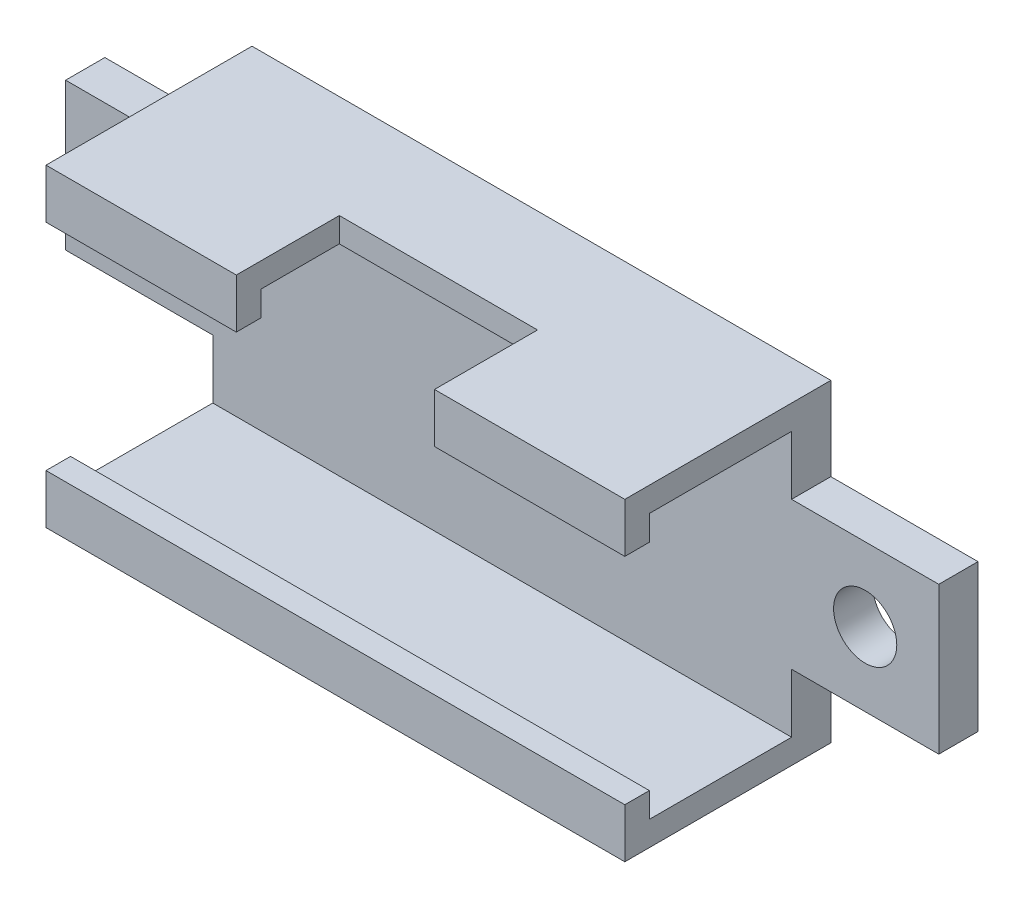
ISO-10303-21;
HEADER;
FILE_DESCRIPTION(('STEP AP214'),'2;1');
FILE_NAME('part.step','',(''),(''),'','','');
FILE_SCHEMA(('AUTOMOTIVE_DESIGN { 1 0 10303 214 1 1 1 1 }'));
ENDSEC;
DATA;
#1=APPLICATION_CONTEXT('core data for automotive mechanical design processes');
#2=APPLICATION_PROTOCOL_DEFINITION('international standard','automotive_design',2000,#1);
#3=PRODUCT_CONTEXT('',#1,'mechanical');
#4=PRODUCT('Part','Part','',(#3));
#5=PRODUCT_RELATED_PRODUCT_CATEGORY('part','',(#4));
#6=PRODUCT_DEFINITION_FORMATION('','',#4);
#7=PRODUCT_DEFINITION_CONTEXT('part definition',#1,'design');
#8=PRODUCT_DEFINITION('design','',#6,#7);
#9=PRODUCT_DEFINITION_SHAPE('','',#8);
#10=(LENGTH_UNIT() NAMED_UNIT(*) SI_UNIT(.MILLI.,.METRE.));
#11=(NAMED_UNIT(*) PLANE_ANGLE_UNIT() SI_UNIT($,.RADIAN.));
#12=(NAMED_UNIT(*) SI_UNIT($,.STERADIAN.) SOLID_ANGLE_UNIT());
#13=UNCERTAINTY_MEASURE_WITH_UNIT(LENGTH_MEASURE(1.E-05),#10,'distance_accuracy_value','');
#14=(GEOMETRIC_REPRESENTATION_CONTEXT(3) GLOBAL_UNCERTAINTY_ASSIGNED_CONTEXT((#13)) GLOBAL_UNIT_ASSIGNED_CONTEXT((#10,
#11,#12)) REPRESENTATION_CONTEXT('',''));
#15=CARTESIAN_POINT('',(0.,0.,0.));
#16=DIRECTION('',(0.,0.,1.));
#17=DIRECTION('',(1.,0.,0.));
#18=AXIS2_PLACEMENT_3D('',#15,#16,#17);
#19=CARTESIAN_POINT('',(0.,0.,8.5));
#20=DIRECTION('',(0.,0.,1.));
#21=DIRECTION('',(1.,0.,0.));
#22=AXIS2_PLACEMENT_3D('',#19,#20,#21);
#23=PLANE('',#22);
#24=DIRECTION('',(0.,-1.,0.));
#25=VECTOR('',#24,1.);
#26=CARTESIAN_POINT('',(9.7,16.75,8.5));
#27=LINE('',#26,#25);
#28=CARTESIAN_POINT('',(9.7,16.,8.5));
#29=VERTEX_POINT('',#28);
#30=CARTESIAN_POINT('',(9.7,13.48,8.5));
#31=VERTEX_POINT('',#30);
#32=EDGE_CURVE('E428',#29,#31,#27,.T.);
#33=ORIENTED_EDGE('',*,*,#32,.F.);
#34=DIRECTION('',(-1.,0.,0.));
#35=VECTOR('',#34,1.);
#36=CARTESIAN_POINT('',(0.,16.,8.5));
#37=LINE('',#36,#35);
#38=CARTESIAN_POINT('',(0.,16.,8.5));
#39=VERTEX_POINT('',#38);
#40=EDGE_CURVE('E243',#29,#39,#37,.T.);
#41=ORIENTED_EDGE('',*,*,#40,.T.);
#42=DIRECTION('',(0.,-1.,0.));
#43=VECTOR('',#42,1.);
#44=CARTESIAN_POINT('',(0.,16.,8.5));
#45=LINE('',#44,#43);
#46=CARTESIAN_POINT('',(0.,13.48,8.5));
#47=VERTEX_POINT('',#46);
#48=EDGE_CURVE('E315',#39,#47,#45,.T.);
#49=ORIENTED_EDGE('',*,*,#48,.T.);
#50=DIRECTION('',(-1.,0.,0.));
#51=VECTOR('',#50,1.);
#52=CARTESIAN_POINT('',(0.,13.48,8.5));
#53=LINE('',#52,#51);
#54=EDGE_CURVE('E283',#31,#47,#53,.T.);
#55=ORIENTED_EDGE('',*,*,#54,.F.);
#56=EDGE_LOOP('',(#33,#41,#49,#55));
#57=FACE_BOUND('',#56,.T.);
#58=ADVANCED_FACE('F43',(#57),#23,.T.);
#59=CARTESIAN_POINT('',(0.,13.48,7.25));
#60=DIRECTION('',(0.,0.,1.));
#61=DIRECTION('',(1.,0.,0.));
#62=AXIS2_PLACEMENT_3D('',#59,#60,#61);
#63=PLANE('',#62);
#64=DIRECTION('',(1.,0.,0.));
#65=VECTOR('',#64,1.);
#66=CARTESIAN_POINT('',(0.,14.75,7.25));
#67=LINE('',#66,#65);
#68=CARTESIAN_POINT('',(0.,14.75,7.25));
#69=VERTEX_POINT('',#68);
#70=CARTESIAN_POINT('',(9.7,14.75,7.25));
#71=VERTEX_POINT('',#70);
#72=EDGE_CURVE('E276',#69,#71,#67,.T.);
#73=ORIENTED_EDGE('',*,*,#72,.T.);
#74=DIRECTION('',(0.,-1.,0.));
#75=VECTOR('',#74,1.);
#76=CARTESIAN_POINT('',(9.7,13.48,7.25));
#77=LINE('',#76,#75);
#78=CARTESIAN_POINT('',(9.7,13.48,7.25));
#79=VERTEX_POINT('',#78);
#80=EDGE_CURVE('E227',#71,#79,#77,.T.);
#81=ORIENTED_EDGE('',*,*,#80,.T.);
#82=DIRECTION('',(1.,0.,0.));
#83=VECTOR('',#82,1.);
#84=CARTESIAN_POINT('',(0.,13.48,7.25));
#85=LINE('',#84,#83);
#86=CARTESIAN_POINT('',(0.,13.48,7.25));
#87=VERTEX_POINT('',#86);
#88=EDGE_CURVE('E277',#87,#79,#85,.T.);
#89=ORIENTED_EDGE('',*,*,#88,.F.);
#90=DIRECTION('',(0.,1.,0.));
#91=VECTOR('',#90,1.);
#92=CARTESIAN_POINT('',(0.,13.48,7.25));
#93=LINE('',#92,#91);
#94=EDGE_CURVE('E292',#87,#69,#93,.T.);
#95=ORIENTED_EDGE('',*,*,#94,.T.);
#96=EDGE_LOOP('',(#73,#81,#89,#95));
#97=FACE_BOUND('',#96,.T.);
#98=ADVANCED_FACE('F432',(#97),#63,.F.);
#99=CARTESIAN_POINT('',(0.,13.48,0.));
#100=DIRECTION('',(0.,-1.,0.));
#101=DIRECTION('',(0.,0.,-1.));
#102=AXIS2_PLACEMENT_3D('',#99,#100,#101);
#103=PLANE('',#102);
#104=DIRECTION('',(0.,0.,-1.));
#105=VECTOR('',#104,1.);
#106=CARTESIAN_POINT('',(9.7,13.48,0.));
#107=LINE('',#106,#105);
#108=EDGE_CURVE('E51',#31,#79,#107,.T.);
#109=ORIENTED_EDGE('',*,*,#108,.F.);
#110=ORIENTED_EDGE('',*,*,#54,.T.);
#111=DIRECTION('',(0.,0.,-1.));
#112=VECTOR('',#111,1.);
#113=CARTESIAN_POINT('',(0.,13.48,8.5));
#114=LINE('',#113,#112);
#115=EDGE_CURVE('E272',#47,#87,#114,.T.);
#116=ORIENTED_EDGE('',*,*,#115,.T.);
#117=ORIENTED_EDGE('',*,*,#88,.T.);
#118=EDGE_LOOP('',(#109,#110,#116,#117));
#119=FACE_BOUND('',#118,.T.);
#120=ADVANCED_FACE('F434',(#119),#103,.T.);
#121=CARTESIAN_POINT('',(0.,14.75,8.5));
#122=DIRECTION('',(0.,1.,0.));
#123=DIRECTION('',(0.,0.,1.));
#124=AXIS2_PLACEMENT_3D('',#121,#122,#123);
#125=PLANE('',#124);
#126=DIRECTION('',(-1.,0.,0.));
#127=VECTOR('',#126,1.);
#128=CARTESIAN_POINT('',(0.,14.75,3.25));
#129=LINE('',#128,#127);
#130=CARTESIAN_POINT('',(19.8,14.75,3.25));
#131=VERTEX_POINT('',#130);
#132=CARTESIAN_POINT('',(9.7,14.75,3.25));
#133=VERTEX_POINT('',#132);
#134=EDGE_CURVE('E235',#131,#133,#129,.T.);
#135=ORIENTED_EDGE('',*,*,#134,.T.);
#136=DIRECTION('',(0.,0.,1.));
#137=VECTOR('',#136,1.);
#138=CARTESIAN_POINT('',(9.7,14.75,8.5));
#139=LINE('',#138,#137);
#140=EDGE_CURVE('E246',#133,#71,#139,.T.);
#141=ORIENTED_EDGE('',*,*,#140,.T.);
#142=ORIENTED_EDGE('',*,*,#72,.F.);
#143=DIRECTION('',(0.,0.,-1.));
#144=VECTOR('',#143,1.);
#145=CARTESIAN_POINT('',(0.,14.75,8.5));
#146=LINE('',#145,#144);
#147=CARTESIAN_POINT('',(0.,14.75,0.));
#148=VERTEX_POINT('',#147);
#149=EDGE_CURVE('E294',#69,#148,#146,.T.);
#150=ORIENTED_EDGE('',*,*,#149,.T.);
#151=DIRECTION('',(1.,0.,0.));
#152=VECTOR('',#151,1.);
#153=CARTESIAN_POINT('',(0.,14.75,0.));
#154=LINE('',#153,#152);
#155=CARTESIAN_POINT('',(29.5,14.75,0.));
#156=VERTEX_POINT('',#155);
#157=EDGE_CURVE('E306',#148,#156,#154,.T.);
#158=ORIENTED_EDGE('',*,*,#157,.T.);
#159=DIRECTION('',(0.,0.,-1.));
#160=VECTOR('',#159,1.);
#161=CARTESIAN_POINT('',(29.5,14.75,8.5));
#162=LINE('',#161,#160);
#163=CARTESIAN_POINT('',(29.5,14.75,7.25));
#164=VERTEX_POINT('',#163);
#165=EDGE_CURVE('E311',#164,#156,#162,.T.);
#166=ORIENTED_EDGE('',*,*,#165,.F.);
#167=CARTESIAN_POINT('',(19.8,14.75,7.25));
#168=VERTEX_POINT('',#167);
#169=EDGE_CURVE('E271',#168,#164,#67,.T.);
#170=ORIENTED_EDGE('',*,*,#169,.F.);
#171=DIRECTION('',(0.,0.,-1.));
#172=VECTOR('',#171,1.);
#173=CARTESIAN_POINT('',(19.8,14.75,8.5));
#174=LINE('',#173,#172);
#175=EDGE_CURVE('E228',#168,#131,#174,.T.);
#176=ORIENTED_EDGE('',*,*,#175,.T.);
#177=EDGE_LOOP('',(#135,#141,#142,#150,#158,#166,#170,#176));
#178=FACE_BOUND('',#177,.T.);
#179=ADVANCED_FACE('F442',(#178),#125,.F.);
#180=CARTESIAN_POINT('',(0.,0.,0.));
#181=DIRECTION('',(0.,0.,-1.));
#182=DIRECTION('',(-1.,0.,0.));
#183=AXIS2_PLACEMENT_3D('',#180,#181,#182);
#184=PLANE('',#183);
#185=CARTESIAN_POINT('',(33.25,8.,0.));
#186=DIRECTION('',(0.,0.,1.));
#187=DIRECTION('',(1.,0.,0.));
#188=AXIS2_PLACEMENT_3D('',#185,#186,#187);
#189=CIRCLE('',#188,1.61);
#190=CARTESIAN_POINT('',(34.86,8.,0.));
#191=VERTEX_POINT('',#190);
#192=EDGE_CURVE('E323',#191,#191,#189,.T.);
#193=ORIENTED_EDGE('',*,*,#192,.F.);
#194=EDGE_LOOP('',(#193));
#195=FACE_BOUND('',#194,.T.);
#196=CARTESIAN_POINT('',(-3.75,8.,0.));
#197=DIRECTION('',(0.,0.,1.));
#198=DIRECTION('',(1.,0.,0.));
#199=AXIS2_PLACEMENT_3D('',#196,#197,#198);
#200=CIRCLE('',#199,1.61);
#201=CARTESIAN_POINT('',(-2.14,8.,0.));
#202=VERTEX_POINT('',#201);
#203=EDGE_CURVE('E309',#202,#202,#200,.T.);
#204=ORIENTED_EDGE('',*,*,#203,.F.);
#205=EDGE_LOOP('',(#204));
#206=FACE_BOUND('',#205,.T.);
#207=DIRECTION('',(-1.,0.,0.));
#208=VECTOR('',#207,1.);
#209=CARTESIAN_POINT('',(0.,1.25,0.));
#210=LINE('',#209,#208);
#211=CARTESIAN_POINT('',(29.5,1.25,0.));
#212=VERTEX_POINT('',#211);
#213=CARTESIAN_POINT('',(0.,1.25,0.));
#214=VERTEX_POINT('',#213);
#215=EDGE_CURVE('E299',#212,#214,#210,.T.);
#216=ORIENTED_EDGE('',*,*,#215,.F.);
#217=DIRECTION('',(0.,1.,0.));
#218=VECTOR('',#217,1.);
#219=CARTESIAN_POINT('',(29.5,4.25,0.));
#220=LINE('',#219,#218);
#221=CARTESIAN_POINT('',(29.5,4.25,0.));
#222=VERTEX_POINT('',#221);
#223=EDGE_CURVE('E386',#212,#222,#220,.T.);
#224=ORIENTED_EDGE('',*,*,#223,.T.);
#225=DIRECTION('',(1.,0.,0.));
#226=VECTOR('',#225,1.);
#227=CARTESIAN_POINT('',(29.5,4.25,0.));
#228=LINE('',#227,#226);
#229=CARTESIAN_POINT('',(37.,4.25,0.));
#230=VERTEX_POINT('',#229);
#231=EDGE_CURVE('E388',#222,#230,#228,.T.);
#232=ORIENTED_EDGE('',*,*,#231,.T.);
#233=DIRECTION('',(0.,1.,0.));
#234=VECTOR('',#233,1.);
#235=CARTESIAN_POINT('',(37.,11.75,0.));
#236=LINE('',#235,#234);
#237=CARTESIAN_POINT('',(37.,11.75,0.));
#238=VERTEX_POINT('',#237);
#239=EDGE_CURVE('E391',#230,#238,#236,.T.);
#240=ORIENTED_EDGE('',*,*,#239,.T.);
#241=DIRECTION('',(-1.,0.,0.));
#242=VECTOR('',#241,1.);
#243=CARTESIAN_POINT('',(29.5,11.75,0.));
#244=LINE('',#243,#242);
#245=CARTESIAN_POINT('',(29.5,11.75,0.));
#246=VERTEX_POINT('',#245);
#247=EDGE_CURVE('E394',#238,#246,#244,.T.);
#248=ORIENTED_EDGE('',*,*,#247,.T.);
#249=DIRECTION('',(0.,1.,0.));
#250=VECTOR('',#249,1.);
#251=CARTESIAN_POINT('',(29.5,16.,0.));
#252=LINE('',#251,#250);
#253=EDGE_CURVE('E339',#246,#156,#252,.T.);
#254=ORIENTED_EDGE('',*,*,#253,.T.);
#255=ORIENTED_EDGE('',*,*,#157,.F.);
#256=DIRECTION('',(0.,-1.,0.));
#257=VECTOR('',#256,1.);
#258=CARTESIAN_POINT('',(0.,16.,0.));
#259=LINE('',#258,#257);
#260=CARTESIAN_POINT('',(0.,11.75,0.));
#261=VERTEX_POINT('',#260);
#262=EDGE_CURVE('E334',#148,#261,#259,.T.);
#263=ORIENTED_EDGE('',*,*,#262,.T.);
#264=DIRECTION('',(-1.,0.,0.));
#265=VECTOR('',#264,1.);
#266=CARTESIAN_POINT('',(0.,11.75,0.));
#267=LINE('',#266,#265);
#268=CARTESIAN_POINT('',(-7.5,11.75,0.));
#269=VERTEX_POINT('',#268);
#270=EDGE_CURVE('E374',#261,#269,#267,.T.);
#271=ORIENTED_EDGE('',*,*,#270,.T.);
#272=DIRECTION('',(0.,-1.,0.));
#273=VECTOR('',#272,1.);
#274=CARTESIAN_POINT('',(-7.5,11.75,0.));
#275=LINE('',#274,#273);
#276=CARTESIAN_POINT('',(-7.5,4.25,0.));
#277=VERTEX_POINT('',#276);
#278=EDGE_CURVE('E377',#269,#277,#275,.T.);
#279=ORIENTED_EDGE('',*,*,#278,.T.);
#280=DIRECTION('',(1.,0.,0.));
#281=VECTOR('',#280,1.);
#282=CARTESIAN_POINT('',(0.,4.25,0.));
#283=LINE('',#282,#281);
#284=CARTESIAN_POINT('',(0.,4.25,0.));
#285=VERTEX_POINT('',#284);
#286=EDGE_CURVE('E380',#277,#285,#283,.T.);
#287=ORIENTED_EDGE('',*,*,#286,.T.);
#288=DIRECTION('',(0.,-1.,0.));
#289=VECTOR('',#288,1.);
#290=CARTESIAN_POINT('',(0.,4.25,0.));
#291=LINE('',#290,#289);
#292=EDGE_CURVE('E383',#285,#214,#291,.T.);
#293=ORIENTED_EDGE('',*,*,#292,.T.);
#294=EDGE_LOOP('',(#216,#224,#232,#240,#248,#254,#255,#263,#271,#279,#287,#293));
#295=FACE_BOUND('',#294,.T.);
#296=ADVANCED_FACE('F508',(#195,#206,#295),#184,.F.);
#297=CARTESIAN_POINT('',(0.,16.,-2.));
#298=DIRECTION('',(-1.,0.,0.));
#299=DIRECTION('',(0.,-1.,0.));
#300=AXIS2_PLACEMENT_3D('',#297,#298,#299);
#301=PLANE('',#300);
#302=ORIENTED_EDGE('',*,*,#262,.F.);
#303=ORIENTED_EDGE('',*,*,#149,.F.);
#304=ORIENTED_EDGE('',*,*,#94,.F.);
#305=ORIENTED_EDGE('',*,*,#115,.F.);
#306=ORIENTED_EDGE('',*,*,#48,.F.);
#307=DIRECTION('',(0.,0.,1.));
#308=VECTOR('',#307,1.);
#309=CARTESIAN_POINT('',(0.,16.,-2.));
#310=LINE('',#309,#308);
#311=CARTESIAN_POINT('',(0.,16.,-2.));
#312=VERTEX_POINT('',#311);
#313=EDGE_CURVE('E399',#312,#39,#310,.T.);
#314=ORIENTED_EDGE('',*,*,#313,.F.);
#315=DIRECTION('',(0.,-1.,0.));
#316=VECTOR('',#315,1.);
#317=CARTESIAN_POINT('',(0.,16.,-2.));
#318=LINE('',#317,#316);
#319=CARTESIAN_POINT('',(0.,11.75,-2.));
#320=VERTEX_POINT('',#319);
#321=EDGE_CURVE('E335',#312,#320,#318,.T.);
#322=ORIENTED_EDGE('',*,*,#321,.T.);
#323=DIRECTION('',(0.,0.,1.));
#324=VECTOR('',#323,1.);
#325=CARTESIAN_POINT('',(0.,11.75,-2.));
#326=LINE('',#325,#324);
#327=EDGE_CURVE('E372',#320,#261,#326,.T.);
#328=ORIENTED_EDGE('',*,*,#327,.T.);
#329=EDGE_LOOP('',(#302,#303,#304,#305,#306,#314,#322,#328));
#330=FACE_BOUND('',#329,.T.);
#331=ADVANCED_FACE('F45',(#330),#301,.T.);
#332=CARTESIAN_POINT('',(0.,16.,-2.));
#333=DIRECTION('',(0.,1.,0.));
#334=DIRECTION('',(0.,0.,1.));
#335=AXIS2_PLACEMENT_3D('',#332,#333,#334);
#336=PLANE('',#335);
#337=DIRECTION('',(0.,0.,1.));
#338=VECTOR('',#337,1.);
#339=CARTESIAN_POINT('',(9.7,16.,-2.));
#340=LINE('',#339,#338);
#341=CARTESIAN_POINT('',(9.7,16.,3.25));
#342=VERTEX_POINT('',#341);
#343=EDGE_CURVE('E241',#342,#29,#340,.T.);
#344=ORIENTED_EDGE('',*,*,#343,.F.);
#345=DIRECTION('',(-1.,0.,0.));
#346=VECTOR('',#345,1.);
#347=CARTESIAN_POINT('',(0.,16.,3.25));
#348=LINE('',#347,#346);
#349=CARTESIAN_POINT('',(19.8,16.,3.25));
#350=VERTEX_POINT('',#349);
#351=EDGE_CURVE('E11',#350,#342,#348,.T.);
#352=ORIENTED_EDGE('',*,*,#351,.F.);
#353=DIRECTION('',(0.,0.,-1.));
#354=VECTOR('',#353,1.);
#355=CARTESIAN_POINT('',(19.8,16.,-2.));
#356=LINE('',#355,#354);
#357=CARTESIAN_POINT('',(19.8,16.,8.5));
#358=VERTEX_POINT('',#357);
#359=EDGE_CURVE('E216',#358,#350,#356,.T.);
#360=ORIENTED_EDGE('',*,*,#359,.F.);
#361=CARTESIAN_POINT('',(29.5,16.,8.5));
#362=VERTEX_POINT('',#361);
#363=EDGE_CURVE('E316',#362,#358,#37,.T.);
#364=ORIENTED_EDGE('',*,*,#363,.F.);
#365=DIRECTION('',(0.,0.,1.));
#366=VECTOR('',#365,1.);
#367=CARTESIAN_POINT('',(29.5,16.,-2.));
#368=LINE('',#367,#366);
#369=CARTESIAN_POINT('',(29.5,16.,-2.));
#370=VERTEX_POINT('',#369);
#371=EDGE_CURVE('E402',#370,#362,#368,.T.);
#372=ORIENTED_EDGE('',*,*,#371,.F.);
#373=DIRECTION('',(-1.,0.,0.));
#374=VECTOR('',#373,1.);
#375=CARTESIAN_POINT('',(0.,16.,-2.));
#376=LINE('',#375,#374);
#377=EDGE_CURVE('E369',#370,#312,#376,.T.);
#378=ORIENTED_EDGE('',*,*,#377,.T.);
#379=ORIENTED_EDGE('',*,*,#313,.T.);
#380=ORIENTED_EDGE('',*,*,#40,.F.);
#381=EDGE_LOOP('',(#344,#352,#360,#364,#372,#378,#379,#380));
#382=FACE_BOUND('',#381,.T.);
#383=ADVANCED_FACE('F239',(#382),#336,.T.);
#384=CARTESIAN_POINT('',(29.5,16.,-2.));
#385=DIRECTION('',(1.,0.,0.));
#386=DIRECTION('',(0.,0.,-1.));
#387=AXIS2_PLACEMENT_3D('',#384,#385,#386);
#388=PLANE('',#387);
#389=ORIENTED_EDGE('',*,*,#253,.F.);
#390=DIRECTION('',(0.,0.,1.));
#391=VECTOR('',#390,1.);
#392=CARTESIAN_POINT('',(29.5,11.75,-2.));
#393=LINE('',#392,#391);
#394=CARTESIAN_POINT('',(29.5,11.75,-2.));
#395=VERTEX_POINT('',#394);
#396=EDGE_CURVE('E404',#395,#246,#393,.T.);
#397=ORIENTED_EDGE('',*,*,#396,.F.);
#398=DIRECTION('',(0.,1.,0.));
#399=VECTOR('',#398,1.);
#400=CARTESIAN_POINT('',(29.5,16.,-2.));
#401=LINE('',#400,#399);
#402=EDGE_CURVE('E366',#395,#370,#401,.T.);
#403=ORIENTED_EDGE('',*,*,#402,.T.);
#404=ORIENTED_EDGE('',*,*,#371,.T.);
#405=DIRECTION('',(0.,1.,0.));
#406=VECTOR('',#405,1.);
#407=CARTESIAN_POINT('',(29.5,16.,8.5));
#408=LINE('',#407,#406);
#409=CARTESIAN_POINT('',(29.5,13.48,8.5));
#410=VERTEX_POINT('',#409);
#411=EDGE_CURVE('E318',#410,#362,#408,.T.);
#412=ORIENTED_EDGE('',*,*,#411,.F.);
#413=DIRECTION('',(0.,0.,1.));
#414=VECTOR('',#413,1.);
#415=CARTESIAN_POINT('',(29.5,13.48,8.5));
#416=LINE('',#415,#414);
#417=CARTESIAN_POINT('',(29.5,13.48,7.25));
#418=VERTEX_POINT('',#417);
#419=EDGE_CURVE('E280',#418,#410,#416,.T.);
#420=ORIENTED_EDGE('',*,*,#419,.F.);
#421=DIRECTION('',(0.,1.,0.));
#422=VECTOR('',#421,1.);
#423=CARTESIAN_POINT('',(29.5,13.48,7.25));
#424=LINE('',#423,#422);
#425=EDGE_CURVE('E287',#418,#164,#424,.T.);
#426=ORIENTED_EDGE('',*,*,#425,.T.);
#427=ORIENTED_EDGE('',*,*,#165,.T.);
#428=EDGE_LOOP('',(#389,#397,#403,#404,#412,#420,#426,#427));
#429=FACE_BOUND('',#428,.T.);
#430=ADVANCED_FACE('F465',(#429),#388,.T.);
#431=CARTESIAN_POINT('',(29.5,11.75,-2.));
#432=DIRECTION('',(0.,1.,0.));
#433=DIRECTION('',(0.,0.,1.));
#434=AXIS2_PLACEMENT_3D('',#431,#432,#433);
#435=PLANE('',#434);
#436=ORIENTED_EDGE('',*,*,#247,.F.);
#437=DIRECTION('',(0.,0.,1.));
#438=VECTOR('',#437,1.);
#439=CARTESIAN_POINT('',(37.,11.75,-2.));
#440=LINE('',#439,#438);
#441=CARTESIAN_POINT('',(37.,11.75,-2.));
#442=VERTEX_POINT('',#441);
#443=EDGE_CURVE('E406',#442,#238,#440,.T.);
#444=ORIENTED_EDGE('',*,*,#443,.F.);
#445=DIRECTION('',(-1.,0.,0.));
#446=VECTOR('',#445,1.);
#447=CARTESIAN_POINT('',(29.5,11.75,-2.));
#448=LINE('',#447,#446);
#449=EDGE_CURVE('E363',#442,#395,#448,.T.);
#450=ORIENTED_EDGE('',*,*,#449,.T.);
#451=ORIENTED_EDGE('',*,*,#396,.T.);
#452=EDGE_LOOP('',(#436,#444,#450,#451));
#453=FACE_BOUND('',#452,.T.);
#454=ADVANCED_FACE('F514',(#453),#435,.T.);
#455=CARTESIAN_POINT('',(37.,11.75,-2.));
#456=DIRECTION('',(1.,0.,0.));
#457=DIRECTION('',(0.,0.,-1.));
#458=AXIS2_PLACEMENT_3D('',#455,#456,#457);
#459=PLANE('',#458);
#460=ORIENTED_EDGE('',*,*,#239,.F.);
#461=DIRECTION('',(0.,0.,1.));
#462=VECTOR('',#461,1.);
#463=CARTESIAN_POINT('',(37.,4.25,-2.));
#464=LINE('',#463,#462);
#465=CARTESIAN_POINT('',(37.,4.25,-2.));
#466=VERTEX_POINT('',#465);
#467=EDGE_CURVE('E408',#466,#230,#464,.T.);
#468=ORIENTED_EDGE('',*,*,#467,.F.);
#469=DIRECTION('',(0.,1.,0.));
#470=VECTOR('',#469,1.);
#471=CARTESIAN_POINT('',(37.,11.75,-2.));
#472=LINE('',#471,#470);
#473=EDGE_CURVE('E360',#466,#442,#472,.T.);
#474=ORIENTED_EDGE('',*,*,#473,.T.);
#475=ORIENTED_EDGE('',*,*,#443,.T.);
#476=EDGE_LOOP('',(#460,#468,#474,#475));
#477=FACE_BOUND('',#476,.T.);
#478=ADVANCED_FACE('F517',(#477),#459,.T.);
#479=CARTESIAN_POINT('',(29.5,4.25,-2.));
#480=DIRECTION('',(0.,-1.,0.));
#481=DIRECTION('',(0.,0.,-1.));
#482=AXIS2_PLACEMENT_3D('',#479,#480,#481);
#483=PLANE('',#482);
#484=ORIENTED_EDGE('',*,*,#231,.F.);
#485=DIRECTION('',(0.,0.,1.));
#486=VECTOR('',#485,1.);
#487=CARTESIAN_POINT('',(29.5,4.25,-2.));
#488=LINE('',#487,#486);
#489=CARTESIAN_POINT('',(29.5,4.25,-2.));
#490=VERTEX_POINT('',#489);
#491=EDGE_CURVE('E410',#490,#222,#488,.T.);
#492=ORIENTED_EDGE('',*,*,#491,.F.);
#493=DIRECTION('',(1.,0.,0.));
#494=VECTOR('',#493,1.);
#495=CARTESIAN_POINT('',(29.5,4.25,-2.));
#496=LINE('',#495,#494);
#497=EDGE_CURVE('E357',#490,#466,#496,.T.);
#498=ORIENTED_EDGE('',*,*,#497,.T.);
#499=ORIENTED_EDGE('',*,*,#467,.T.);
#500=EDGE_LOOP('',(#484,#492,#498,#499));
#501=FACE_BOUND('',#500,.T.);
#502=ADVANCED_FACE('F521',(#501),#483,.T.);
#503=CARTESIAN_POINT('',(29.5,4.25,-2.));
#504=DIRECTION('',(1.,0.,0.));
#505=DIRECTION('',(0.,0.,-1.));
#506=AXIS2_PLACEMENT_3D('',#503,#504,#505);
#507=PLANE('',#506);
#508=ORIENTED_EDGE('',*,*,#223,.F.);
#509=DIRECTION('',(0.,0.,-1.));
#510=VECTOR('',#509,1.);
#511=CARTESIAN_POINT('',(29.5,1.25,8.5));
#512=LINE('',#511,#510);
#513=CARTESIAN_POINT('',(29.5,1.25000000000001,7.25));
#514=VERTEX_POINT('',#513);
#515=EDGE_CURVE('E66',#514,#212,#512,.T.);
#516=ORIENTED_EDGE('',*,*,#515,.F.);
#517=DIRECTION('',(0.,-1.,0.));
#518=VECTOR('',#517,1.);
#519=CARTESIAN_POINT('',(29.5,2.52000000000001,7.25));
#520=LINE('',#519,#518);
#521=CARTESIAN_POINT('',(29.5,2.52000000000001,7.25));
#522=VERTEX_POINT('',#521);
#523=EDGE_CURVE('E269',#522,#514,#520,.T.);
#524=ORIENTED_EDGE('',*,*,#523,.F.);
#525=DIRECTION('',(0.,0.,1.));
#526=VECTOR('',#525,1.);
#527=CARTESIAN_POINT('',(29.5,2.52000000000001,8.5));
#528=LINE('',#527,#526);
#529=CARTESIAN_POINT('',(29.5,2.52000000000001,8.5));
#530=VERTEX_POINT('',#529);
#531=EDGE_CURVE('E260',#522,#530,#528,.T.);
#532=ORIENTED_EDGE('',*,*,#531,.T.);
#533=DIRECTION('',(0.,1.,0.));
#534=VECTOR('',#533,1.);
#535=CARTESIAN_POINT('',(29.5,0.,8.5));
#536=LINE('',#535,#534);
#537=CARTESIAN_POINT('',(29.5,0.,8.5));
#538=VERTEX_POINT('',#537);
#539=EDGE_CURVE('E302',#538,#530,#536,.T.);
#540=ORIENTED_EDGE('',*,*,#539,.F.);
#541=DIRECTION('',(0.,0.,1.));
#542=VECTOR('',#541,1.);
#543=CARTESIAN_POINT('',(29.5,0.,-2.));
#544=LINE('',#543,#542);
#545=CARTESIAN_POINT('',(29.5,0.,-2.));
#546=VERTEX_POINT('',#545);
#547=EDGE_CURVE('E413',#546,#538,#544,.T.);
#548=ORIENTED_EDGE('',*,*,#547,.F.);
#549=DIRECTION('',(0.,1.,0.));
#550=VECTOR('',#549,1.);
#551=CARTESIAN_POINT('',(29.5,4.25,-2.));
#552=LINE('',#551,#550);
#553=EDGE_CURVE('E354',#546,#490,#552,.T.);
#554=ORIENTED_EDGE('',*,*,#553,.T.);
#555=ORIENTED_EDGE('',*,*,#491,.T.);
#556=EDGE_LOOP('',(#508,#516,#524,#532,#540,#548,#554,#555));
#557=FACE_BOUND('',#556,.T.);
#558=ADVANCED_FACE('F525',(#557),#507,.T.);
#559=CARTESIAN_POINT('',(0.,0.,-2.));
#560=DIRECTION('',(0.,-1.,0.));
#561=DIRECTION('',(1.,0.,0.));
#562=AXIS2_PLACEMENT_3D('',#559,#560,#561);
#563=PLANE('',#562);
#564=ORIENTED_EDGE('',*,*,#547,.T.);
#565=DIRECTION('',(1.,0.,0.));
#566=VECTOR('',#565,1.);
#567=CARTESIAN_POINT('',(0.,0.,8.5));
#568=LINE('',#567,#566);
#569=CARTESIAN_POINT('',(0.,0.,8.5));
#570=VERTEX_POINT('',#569);
#571=EDGE_CURVE('E298',#570,#538,#568,.T.);
#572=ORIENTED_EDGE('',*,*,#571,.F.);
#573=DIRECTION('',(0.,0.,1.));
#574=VECTOR('',#573,1.);
#575=CARTESIAN_POINT('',(0.,0.,-2.));
#576=LINE('',#575,#574);
#577=CARTESIAN_POINT('',(0.,0.,-2.));
#578=VERTEX_POINT('',#577);
#579=EDGE_CURVE('E415',#578,#570,#576,.T.);
#580=ORIENTED_EDGE('',*,*,#579,.F.);
#581=DIRECTION('',(1.,0.,0.));
#582=VECTOR('',#581,1.);
#583=CARTESIAN_POINT('',(0.,0.,-2.));
#584=LINE('',#583,#582);
#585=EDGE_CURVE('E351',#578,#546,#584,.T.);
#586=ORIENTED_EDGE('',*,*,#585,.T.);
#587=EDGE_LOOP('',(#564,#572,#580,#586));
#588=FACE_BOUND('',#587,.T.);
#589=ADVANCED_FACE('F529',(#588),#563,.T.);
#590=CARTESIAN_POINT('',(0.,4.25,-2.));
#591=DIRECTION('',(-1.,0.,0.));
#592=DIRECTION('',(0.,-1.,0.));
#593=AXIS2_PLACEMENT_3D('',#590,#591,#592);
#594=PLANE('',#593);
#595=ORIENTED_EDGE('',*,*,#292,.F.);
#596=DIRECTION('',(0.,0.,1.));
#597=VECTOR('',#596,1.);
#598=CARTESIAN_POINT('',(0.,4.25,-2.));
#599=LINE('',#598,#597);
#600=CARTESIAN_POINT('',(0.,4.25,-2.));
#601=VERTEX_POINT('',#600);
#602=EDGE_CURVE('E417',#601,#285,#599,.T.);
#603=ORIENTED_EDGE('',*,*,#602,.F.);
#604=DIRECTION('',(0.,-1.,0.));
#605=VECTOR('',#604,1.);
#606=CARTESIAN_POINT('',(0.,4.25,-2.));
#607=LINE('',#606,#605);
#608=EDGE_CURVE('E348',#601,#578,#607,.T.);
#609=ORIENTED_EDGE('',*,*,#608,.T.);
#610=ORIENTED_EDGE('',*,*,#579,.T.);
#611=DIRECTION('',(0.,-1.,0.));
#612=VECTOR('',#611,1.);
#613=CARTESIAN_POINT('',(0.,0.,8.5));
#614=LINE('',#613,#612);
#615=CARTESIAN_POINT('',(0.,2.52,8.5));
#616=VERTEX_POINT('',#615);
#617=EDGE_CURVE('E295',#616,#570,#614,.T.);
#618=ORIENTED_EDGE('',*,*,#617,.F.);
#619=DIRECTION('',(0.,0.,-1.));
#620=VECTOR('',#619,1.);
#621=CARTESIAN_POINT('',(0.,2.52,8.5));
#622=LINE('',#621,#620);
#623=CARTESIAN_POINT('',(0.,2.52,7.25));
#624=VERTEX_POINT('',#623);
#625=EDGE_CURVE('E254',#616,#624,#622,.T.);
#626=ORIENTED_EDGE('',*,*,#625,.T.);
#627=DIRECTION('',(0.,-1.,0.));
#628=VECTOR('',#627,1.);
#629=CARTESIAN_POINT('',(0.,2.52,7.25));
#630=LINE('',#629,#628);
#631=CARTESIAN_POINT('',(0.,1.25,7.25));
#632=VERTEX_POINT('',#631);
#633=EDGE_CURVE('E266',#624,#632,#630,.T.);
#634=ORIENTED_EDGE('',*,*,#633,.T.);
#635=DIRECTION('',(0.,0.,-1.));
#636=VECTOR('',#635,1.);
#637=CARTESIAN_POINT('',(0.,1.25,8.5));
#638=LINE('',#637,#636);
#639=EDGE_CURVE('E304',#632,#214,#638,.T.);
#640=ORIENTED_EDGE('',*,*,#639,.T.);
#641=EDGE_LOOP('',(#595,#603,#609,#610,#618,#626,#634,#640));
#642=FACE_BOUND('',#641,.T.);
#643=ADVANCED_FACE('F533',(#642),#594,.T.);
#644=CARTESIAN_POINT('',(0.,4.25,-2.));
#645=DIRECTION('',(0.,-1.,0.));
#646=DIRECTION('',(1.,0.,0.));
#647=AXIS2_PLACEMENT_3D('',#644,#645,#646);
#648=PLANE('',#647);
#649=ORIENTED_EDGE('',*,*,#286,.F.);
#650=DIRECTION('',(0.,0.,1.));
#651=VECTOR('',#650,1.);
#652=CARTESIAN_POINT('',(-7.5,4.25,-2.));
#653=LINE('',#652,#651);
#654=CARTESIAN_POINT('',(-7.5,4.25,-2.));
#655=VERTEX_POINT('',#654);
#656=EDGE_CURVE('E419',#655,#277,#653,.T.);
#657=ORIENTED_EDGE('',*,*,#656,.F.);
#658=DIRECTION('',(1.,0.,0.));
#659=VECTOR('',#658,1.);
#660=CARTESIAN_POINT('',(0.,4.25,-2.));
#661=LINE('',#660,#659);
#662=EDGE_CURVE('E345',#655,#601,#661,.T.);
#663=ORIENTED_EDGE('',*,*,#662,.T.);
#664=ORIENTED_EDGE('',*,*,#602,.T.);
#665=EDGE_LOOP('',(#649,#657,#663,#664));
#666=FACE_BOUND('',#665,.T.);
#667=ADVANCED_FACE('F537',(#666),#648,.T.);
#668=CARTESIAN_POINT('',(-7.5,11.75,-2.));
#669=DIRECTION('',(-1.,0.,0.));
#670=DIRECTION('',(0.,-1.,0.));
#671=AXIS2_PLACEMENT_3D('',#668,#669,#670);
#672=PLANE('',#671);
#673=ORIENTED_EDGE('',*,*,#278,.F.);
#674=DIRECTION('',(0.,0.,1.));
#675=VECTOR('',#674,1.);
#676=CARTESIAN_POINT('',(-7.5,11.75,-2.));
#677=LINE('',#676,#675);
#678=CARTESIAN_POINT('',(-7.5,11.75,-2.));
#679=VERTEX_POINT('',#678);
#680=EDGE_CURVE('E421',#679,#269,#677,.T.);
#681=ORIENTED_EDGE('',*,*,#680,.F.);
#682=DIRECTION('',(0.,-1.,0.));
#683=VECTOR('',#682,1.);
#684=CARTESIAN_POINT('',(-7.5,11.75,-2.));
#685=LINE('',#684,#683);
#686=EDGE_CURVE('E342',#679,#655,#685,.T.);
#687=ORIENTED_EDGE('',*,*,#686,.T.);
#688=ORIENTED_EDGE('',*,*,#656,.T.);
#689=EDGE_LOOP('',(#673,#681,#687,#688));
#690=FACE_BOUND('',#689,.T.);
#691=ADVANCED_FACE('F541',(#690),#672,.T.);
#692=CARTESIAN_POINT('',(0.,11.75,-2.));
#693=DIRECTION('',(0.,1.,0.));
#694=DIRECTION('',(-1.,0.,0.));
#695=AXIS2_PLACEMENT_3D('',#692,#693,#694);
#696=PLANE('',#695);
#697=ORIENTED_EDGE('',*,*,#270,.F.);
#698=ORIENTED_EDGE('',*,*,#327,.F.);
#699=DIRECTION('',(-1.,0.,0.));
#700=VECTOR('',#699,1.);
#701=CARTESIAN_POINT('',(0.,11.75,-2.));
#702=LINE('',#701,#700);
#703=EDGE_CURVE('E338',#320,#679,#702,.T.);
#704=ORIENTED_EDGE('',*,*,#703,.T.);
#705=ORIENTED_EDGE('',*,*,#680,.T.);
#706=EDGE_LOOP('',(#697,#698,#704,#705));
#707=FACE_BOUND('',#706,.T.);
#708=ADVANCED_FACE('F506',(#707),#696,.T.);
#709=CARTESIAN_POINT('',(0.,0.,-2.));
#710=DIRECTION('',(0.,0.,-1.));
#711=DIRECTION('',(-1.,0.,0.));
#712=AXIS2_PLACEMENT_3D('',#709,#710,#711);
#713=PLANE('',#712);
#714=CARTESIAN_POINT('',(33.25,8.,-2.));
#715=DIRECTION('',(0.,0.,-1.));
#716=DIRECTION('',(-1.,0.,0.));
#717=AXIS2_PLACEMENT_3D('',#714,#715,#716);
#718=CIRCLE('',#717,1.61);
#719=CARTESIAN_POINT('',(34.86,8.,-2.));
#720=VERTEX_POINT('',#719);
#721=EDGE_CURVE('E331',#720,#720,#718,.T.);
#722=ORIENTED_EDGE('',*,*,#721,.F.);
#723=EDGE_LOOP('',(#722));
#724=FACE_BOUND('',#723,.T.);
#725=CARTESIAN_POINT('',(-3.75,8.,-2.));
#726=DIRECTION('',(0.,0.,-1.));
#727=DIRECTION('',(-1.,0.,0.));
#728=AXIS2_PLACEMENT_3D('',#725,#726,#727);
#729=CIRCLE('',#728,1.61);
#730=CARTESIAN_POINT('',(-2.14,8.,-2.));
#731=VERTEX_POINT('',#730);
#732=EDGE_CURVE('E326',#731,#731,#729,.T.);
#733=ORIENTED_EDGE('',*,*,#732,.F.);
#734=EDGE_LOOP('',(#733));
#735=FACE_BOUND('',#734,.T.);
#736=ORIENTED_EDGE('',*,*,#321,.F.);
#737=ORIENTED_EDGE('',*,*,#377,.F.);
#738=ORIENTED_EDGE('',*,*,#402,.F.);
#739=ORIENTED_EDGE('',*,*,#449,.F.);
#740=ORIENTED_EDGE('',*,*,#473,.F.);
#741=ORIENTED_EDGE('',*,*,#497,.F.);
#742=ORIENTED_EDGE('',*,*,#553,.F.);
#743=ORIENTED_EDGE('',*,*,#585,.F.);
#744=ORIENTED_EDGE('',*,*,#608,.F.);
#745=ORIENTED_EDGE('',*,*,#662,.F.);
#746=ORIENTED_EDGE('',*,*,#686,.F.);
#747=ORIENTED_EDGE('',*,*,#703,.F.);
#748=EDGE_LOOP('',(#736,#737,#738,#739,#740,#741,#742,#743,#744,#745,#746,#747));
#749=FACE_BOUND('',#748,.T.);
#750=ADVANCED_FACE('F469',(#724,#735,#749),#713,.T.);
#751=CARTESIAN_POINT('',(-3.75,8.,-7.62));
#752=DIRECTION('',(0.,0.,1.));
#753=DIRECTION('',(1.,0.,0.));
#754=AXIS2_PLACEMENT_3D('',#751,#752,#753);
#755=CYLINDRICAL_SURFACE('',#754,1.61);
#756=CARTESIAN_POINT('',(-2.14,8.,-2.));
#757=CARTESIAN_POINT('',(-2.14,8.,-1.97916666666667));
#758=CARTESIAN_POINT('',(-2.14,8.,-1.95833333333333));
#759=CARTESIAN_POINT('',(-2.14,8.,-1.91666666666667));
#760=CARTESIAN_POINT('',(-2.14,8.,-1.89583333333333));
#761=CARTESIAN_POINT('',(-2.14,8.,-1.85416666666667));
#762=CARTESIAN_POINT('',(-2.14,8.,-1.83333333333333));
#763=CARTESIAN_POINT('',(-2.14,8.,-1.79166666666667));
#764=CARTESIAN_POINT('',(-2.14,8.,-1.77083333333333));
#765=CARTESIAN_POINT('',(-2.14,8.,-1.72916666666667));
#766=CARTESIAN_POINT('',(-2.14,8.,-1.70833333333333));
#767=CARTESIAN_POINT('',(-2.14,8.,-1.66666666666667));
#768=CARTESIAN_POINT('',(-2.14,8.,-1.64583333333333));
#769=CARTESIAN_POINT('',(-2.14,8.,-1.60416666666667));
#770=CARTESIAN_POINT('',(-2.14,8.,-1.58333333333333));
#771=CARTESIAN_POINT('',(-2.14,8.,-1.54166666666667));
#772=CARTESIAN_POINT('',(-2.14,8.,-1.52083333333333));
#773=CARTESIAN_POINT('',(-2.14,8.,-1.47916666666667));
#774=CARTESIAN_POINT('',(-2.14,8.,-1.45833333333333));
#775=CARTESIAN_POINT('',(-2.14,8.,-1.41666666666667));
#776=CARTESIAN_POINT('',(-2.14,8.,-1.39583333333333));
#777=CARTESIAN_POINT('',(-2.14,8.,-1.35416666666667));
#778=CARTESIAN_POINT('',(-2.14,8.,-1.33333333333333));
#779=CARTESIAN_POINT('',(-2.14,8.,-1.29166666666667));
#780=CARTESIAN_POINT('',(-2.14,8.,-1.27083333333333));
#781=CARTESIAN_POINT('',(-2.14,8.,-1.22916666666667));
#782=CARTESIAN_POINT('',(-2.14,8.,-1.20833333333333));
#783=CARTESIAN_POINT('',(-2.14,8.,-1.16666666666667));
#784=CARTESIAN_POINT('',(-2.14,8.,-1.14583333333333));
#785=CARTESIAN_POINT('',(-2.14,8.,-1.10416666666667));
#786=CARTESIAN_POINT('',(-2.14,8.,-1.08333333333333));
#787=CARTESIAN_POINT('',(-2.14,8.,-1.04166666666667));
#788=CARTESIAN_POINT('',(-2.14,8.,-1.02083333333333));
#789=CARTESIAN_POINT('',(-2.14,8.,-0.979166666666667));
#790=CARTESIAN_POINT('',(-2.14,8.,-0.958333333333333));
#791=CARTESIAN_POINT('',(-2.14,8.,-0.916666666666667));
#792=CARTESIAN_POINT('',(-2.14,8.,-0.895833333333333));
#793=CARTESIAN_POINT('',(-2.14,8.,-0.854166666666667));
#794=CARTESIAN_POINT('',(-2.14,8.,-0.833333333333333));
#795=CARTESIAN_POINT('',(-2.14,8.,-0.791666666666667));
#796=CARTESIAN_POINT('',(-2.14,8.,-0.770833333333333));
#797=CARTESIAN_POINT('',(-2.14,8.,-0.729166666666667));
#798=CARTESIAN_POINT('',(-2.14,8.,-0.708333333333333));
#799=CARTESIAN_POINT('',(-2.14,8.,-0.666666666666667));
#800=CARTESIAN_POINT('',(-2.14,8.,-0.645833333333334));
#801=CARTESIAN_POINT('',(-2.14,8.,-0.604166666666667));
#802=CARTESIAN_POINT('',(-2.14,8.,-0.583333333333334));
#803=CARTESIAN_POINT('',(-2.14,8.,-0.541666666666667));
#804=CARTESIAN_POINT('',(-2.14,8.,-0.520833333333334));
#805=CARTESIAN_POINT('',(-2.14,8.,-0.479166666666667));
#806=CARTESIAN_POINT('',(-2.14,8.,-0.458333333333334));
#807=CARTESIAN_POINT('',(-2.14,8.,-0.416666666666667));
#808=CARTESIAN_POINT('',(-2.14,8.,-0.395833333333334));
#809=CARTESIAN_POINT('',(-2.14,8.,-0.354166666666667));
#810=CARTESIAN_POINT('',(-2.14,8.,-0.333333333333334));
#811=CARTESIAN_POINT('',(-2.14,8.,-0.291666666666667));
#812=CARTESIAN_POINT('',(-2.14,8.,-0.270833333333334));
#813=CARTESIAN_POINT('',(-2.14,8.,-0.229166666666667));
#814=CARTESIAN_POINT('',(-2.14,8.,-0.208333333333334));
#815=CARTESIAN_POINT('',(-2.14,8.,-0.166666666666667));
#816=CARTESIAN_POINT('',(-2.14,8.,-0.145833333333333));
#817=CARTESIAN_POINT('',(-2.14,8.,-0.104166666666667));
#818=CARTESIAN_POINT('',(-2.14,8.,-0.0833333333333334));
#819=CARTESIAN_POINT('',(-2.14,8.,-0.0416666666666667));
#820=CARTESIAN_POINT('',(-2.14,8.,-0.0208333333333333));
#821=CARTESIAN_POINT('',(-2.14,8.,0.));
#822=B_SPLINE_CURVE_WITH_KNOTS('',3,(#756,#757,#758,#759,#760,#761,#762,#763,#764,#765,#766,
#767,#768,#769,#770,#771,#772,#773,#774,#775,#776,#777,#778,#779,#780,#781,#782,#783,#784,#785,
#786,#787,#788,#789,#790,#791,#792,#793,#794,#795,#796,#797,#798,#799,#800,#801,#802,#803,#804,
#805,#806,#807,#808,#809,#810,#811,#812,#813,#814,#815,#816,#817,#818,#819,#820,#821),
.UNSPECIFIED.,.F.,.F.,(4,2,2,2,2,2,2,2,2,2,2,2,2,2,2,2,2,2,2,2,2,2,2,2,2,2,2,2,2,2,2,2,4),(0.,
0.0625000000000001,0.125,0.1875,0.25,0.3125,0.375,0.4375,0.5,0.5625,0.625,0.6875,0.75,0.8125,
0.875,0.9375,1.,1.0625,1.125,1.1875,1.25,1.3125,1.375,1.4375,1.5,1.5625,1.625,1.6875,1.75,
1.8125,1.875,1.9375,2.),.UNSPECIFIED.);
#823=EDGE_CURVE('BSEAM494',#731,#202,#822,.T.);
#824=ORIENTED_EDGE('',*,*,#732,.T.);
#825=ORIENTED_EDGE('',*,*,#203,.T.);
#826=ORIENTED_EDGE('',*,*,#823,.T.);
#827=ORIENTED_EDGE('',*,*,#823,.F.);
#828=EDGE_LOOP('',(#824,#826,#825,#827));
#829=FACE_BOUND('',#828,.T.);
#830=ADVANCED_FACE('F494',(#829),#755,.F.);
#831=CARTESIAN_POINT('',(33.25,8.,-7.62));
#832=DIRECTION('',(0.,0.,1.));
#833=DIRECTION('',(1.,0.,0.));
#834=AXIS2_PLACEMENT_3D('',#831,#832,#833);
#835=CYLINDRICAL_SURFACE('',#834,1.61);
#836=CARTESIAN_POINT('',(34.86,8.,-2.));
#837=CARTESIAN_POINT('',(34.86,8.,-1.97916666666667));
#838=CARTESIAN_POINT('',(34.86,8.,-1.95833333333333));
#839=CARTESIAN_POINT('',(34.86,8.,-1.91666666666667));
#840=CARTESIAN_POINT('',(34.86,8.,-1.89583333333333));
#841=CARTESIAN_POINT('',(34.86,8.,-1.85416666666667));
#842=CARTESIAN_POINT('',(34.86,8.,-1.83333333333333));
#843=CARTESIAN_POINT('',(34.86,8.,-1.79166666666667));
#844=CARTESIAN_POINT('',(34.86,8.,-1.77083333333333));
#845=CARTESIAN_POINT('',(34.86,8.,-1.72916666666667));
#846=CARTESIAN_POINT('',(34.86,8.,-1.70833333333333));
#847=CARTESIAN_POINT('',(34.86,8.,-1.66666666666667));
#848=CARTESIAN_POINT('',(34.86,8.,-1.64583333333333));
#849=CARTESIAN_POINT('',(34.86,8.,-1.60416666666667));
#850=CARTESIAN_POINT('',(34.86,8.,-1.58333333333333));
#851=CARTESIAN_POINT('',(34.86,8.,-1.54166666666667));
#852=CARTESIAN_POINT('',(34.86,8.,-1.52083333333333));
#853=CARTESIAN_POINT('',(34.86,8.,-1.47916666666667));
#854=CARTESIAN_POINT('',(34.86,8.,-1.45833333333333));
#855=CARTESIAN_POINT('',(34.86,8.,-1.41666666666667));
#856=CARTESIAN_POINT('',(34.86,8.,-1.39583333333333));
#857=CARTESIAN_POINT('',(34.86,8.,-1.35416666666667));
#858=CARTESIAN_POINT('',(34.86,8.,-1.33333333333333));
#859=CARTESIAN_POINT('',(34.86,8.,-1.29166666666667));
#860=CARTESIAN_POINT('',(34.86,8.,-1.27083333333333));
#861=CARTESIAN_POINT('',(34.86,8.,-1.22916666666667));
#862=CARTESIAN_POINT('',(34.86,8.,-1.20833333333333));
#863=CARTESIAN_POINT('',(34.86,8.,-1.16666666666667));
#864=CARTESIAN_POINT('',(34.86,8.,-1.14583333333333));
#865=CARTESIAN_POINT('',(34.86,8.,-1.10416666666667));
#866=CARTESIAN_POINT('',(34.86,8.,-1.08333333333333));
#867=CARTESIAN_POINT('',(34.86,8.,-1.04166666666667));
#868=CARTESIAN_POINT('',(34.86,8.,-1.02083333333333));
#869=CARTESIAN_POINT('',(34.86,8.,-0.979166666666667));
#870=CARTESIAN_POINT('',(34.86,8.,-0.958333333333333));
#871=CARTESIAN_POINT('',(34.86,8.,-0.916666666666667));
#872=CARTESIAN_POINT('',(34.86,8.,-0.895833333333333));
#873=CARTESIAN_POINT('',(34.86,8.,-0.854166666666667));
#874=CARTESIAN_POINT('',(34.86,8.,-0.833333333333333));
#875=CARTESIAN_POINT('',(34.86,8.,-0.791666666666667));
#876=CARTESIAN_POINT('',(34.86,8.,-0.770833333333333));
#877=CARTESIAN_POINT('',(34.86,8.,-0.729166666666667));
#878=CARTESIAN_POINT('',(34.86,8.,-0.708333333333333));
#879=CARTESIAN_POINT('',(34.86,8.,-0.666666666666667));
#880=CARTESIAN_POINT('',(34.86,8.,-0.645833333333334));
#881=CARTESIAN_POINT('',(34.86,8.,-0.604166666666667));
#882=CARTESIAN_POINT('',(34.86,8.,-0.583333333333334));
#883=CARTESIAN_POINT('',(34.86,8.,-0.541666666666667));
#884=CARTESIAN_POINT('',(34.86,8.,-0.520833333333334));
#885=CARTESIAN_POINT('',(34.86,8.,-0.479166666666667));
#886=CARTESIAN_POINT('',(34.86,8.,-0.458333333333334));
#887=CARTESIAN_POINT('',(34.86,8.,-0.416666666666667));
#888=CARTESIAN_POINT('',(34.86,8.,-0.395833333333334));
#889=CARTESIAN_POINT('',(34.86,8.,-0.354166666666667));
#890=CARTESIAN_POINT('',(34.86,8.,-0.333333333333334));
#891=CARTESIAN_POINT('',(34.86,8.,-0.291666666666667));
#892=CARTESIAN_POINT('',(34.86,8.,-0.270833333333334));
#893=CARTESIAN_POINT('',(34.86,8.,-0.229166666666667));
#894=CARTESIAN_POINT('',(34.86,8.,-0.208333333333334));
#895=CARTESIAN_POINT('',(34.86,8.,-0.166666666666667));
#896=CARTESIAN_POINT('',(34.86,8.,-0.145833333333333));
#897=CARTESIAN_POINT('',(34.86,8.,-0.104166666666667));
#898=CARTESIAN_POINT('',(34.86,8.,-0.0833333333333334));
#899=CARTESIAN_POINT('',(34.86,8.,-0.0416666666666667));
#900=CARTESIAN_POINT('',(34.86,8.,-0.0208333333333333));
#901=CARTESIAN_POINT('',(34.86,8.,0.));
#902=B_SPLINE_CURVE_WITH_KNOTS('',3,(#836,#837,#838,#839,#840,#841,#842,#843,#844,#845,#846,
#847,#848,#849,#850,#851,#852,#853,#854,#855,#856,#857,#858,#859,#860,#861,#862,#863,#864,#865,
#866,#867,#868,#869,#870,#871,#872,#873,#874,#875,#876,#877,#878,#879,#880,#881,#882,#883,#884,
#885,#886,#887,#888,#889,#890,#891,#892,#893,#894,#895,#896,#897,#898,#899,#900,#901),
.UNSPECIFIED.,.F.,.F.,(4,2,2,2,2,2,2,2,2,2,2,2,2,2,2,2,2,2,2,2,2,2,2,2,2,2,2,2,2,2,2,2,4),(0.,
0.0625000000000001,0.125,0.1875,0.25,0.3125,0.375,0.4375,0.5,0.5625,0.625,0.6875,0.75,0.8125,
0.875,0.9375,1.,1.0625,1.125,1.1875,1.25,1.3125,1.375,1.4375,1.5,1.5625,1.625,1.6875,1.75,
1.8125,1.875,1.9375,2.),.UNSPECIFIED.);
#903=EDGE_CURVE('BSEAM485',#720,#191,#902,.T.);
#904=ORIENTED_EDGE('',*,*,#721,.T.);
#905=ORIENTED_EDGE('',*,*,#192,.T.);
#906=ORIENTED_EDGE('',*,*,#903,.T.);
#907=ORIENTED_EDGE('',*,*,#903,.F.);
#908=EDGE_LOOP('',(#904,#906,#905,#907));
#909=FACE_BOUND('',#908,.T.);
#910=ADVANCED_FACE('F485',(#909),#835,.F.);
#911=DIRECTION('',(0.,-1.,0.));
#912=VECTOR('',#911,1.);
#913=CARTESIAN_POINT('',(19.8,16.75,8.5));
#914=LINE('',#913,#912);
#915=CARTESIAN_POINT('',(19.8,13.48,8.5));
#916=VERTEX_POINT('',#915);
#917=EDGE_CURVE('E222',#358,#916,#914,.T.);
#918=ORIENTED_EDGE('',*,*,#917,.T.);
#919=EDGE_CURVE('E284',#410,#916,#53,.T.);
#920=ORIENTED_EDGE('',*,*,#919,.F.);
#921=ORIENTED_EDGE('',*,*,#411,.T.);
#922=ORIENTED_EDGE('',*,*,#363,.T.);
#923=EDGE_LOOP('',(#918,#920,#921,#922));
#924=FACE_BOUND('',#923,.T.);
#925=ADVANCED_FACE('F459',(#924),#23,.T.);
#926=CARTESIAN_POINT('',(0.,1.25,8.5));
#927=DIRECTION('',(0.,-1.,0.));
#928=DIRECTION('',(0.,0.,-1.));
#929=AXIS2_PLACEMENT_3D('',#926,#927,#928);
#930=PLANE('',#929);
#931=ORIENTED_EDGE('',*,*,#639,.F.);
#932=DIRECTION('',(1.,0.,0.));
#933=VECTOR('',#932,1.);
#934=CARTESIAN_POINT('',(0.,1.25,7.25));
#935=LINE('',#934,#933);
#936=EDGE_CURVE('E248',#632,#514,#935,.T.);
#937=ORIENTED_EDGE('',*,*,#936,.T.);
#938=ORIENTED_EDGE('',*,*,#515,.T.);
#939=ORIENTED_EDGE('',*,*,#215,.T.);
#940=EDGE_LOOP('',(#931,#937,#938,#939));
#941=FACE_BOUND('',#940,.T.);
#942=ADVANCED_FACE('F484',(#941),#930,.F.);
#943=CARTESIAN_POINT('',(0.,0.,8.5));
#944=DIRECTION('',(0.,0.,-1.));
#945=DIRECTION('',(-1.,0.,0.));
#946=AXIS2_PLACEMENT_3D('',#943,#944,#945);
#947=PLANE('',#946);
#948=ORIENTED_EDGE('',*,*,#617,.T.);
#949=ORIENTED_EDGE('',*,*,#571,.T.);
#950=ORIENTED_EDGE('',*,*,#539,.T.);
#951=DIRECTION('',(-1.,0.,0.));
#952=VECTOR('',#951,1.);
#953=CARTESIAN_POINT('',(0.,2.52,8.5));
#954=LINE('',#953,#952);
#955=EDGE_CURVE('E257',#530,#616,#954,.T.);
#956=ORIENTED_EDGE('',*,*,#955,.T.);
#957=EDGE_LOOP('',(#948,#949,#950,#956));
#958=FACE_BOUND('',#957,.T.);
#959=ADVANCED_FACE('F491',(#958),#947,.F.);
#960=CARTESIAN_POINT('',(19.8,13.48,7.25));
#961=VERTEX_POINT('',#960);
#962=EDGE_CURVE('E275',#961,#418,#85,.T.);
#963=ORIENTED_EDGE('',*,*,#962,.F.);
#964=DIRECTION('',(0.,1.,0.));
#965=VECTOR('',#964,1.);
#966=CARTESIAN_POINT('',(19.8,13.48,7.25));
#967=LINE('',#966,#965);
#968=EDGE_CURVE('E58',#961,#168,#967,.T.);
#969=ORIENTED_EDGE('',*,*,#968,.T.);
#970=ORIENTED_EDGE('',*,*,#169,.T.);
#971=ORIENTED_EDGE('',*,*,#425,.F.);
#972=EDGE_LOOP('',(#963,#969,#970,#971));
#973=FACE_BOUND('',#972,.T.);
#974=ADVANCED_FACE('F452',(#973),#63,.F.);
#975=DIRECTION('',(0.,0.,1.));
#976=VECTOR('',#975,1.);
#977=CARTESIAN_POINT('',(19.8,13.48,0.));
#978=LINE('',#977,#976);
#979=EDGE_CURVE('E401',#961,#916,#978,.T.);
#980=ORIENTED_EDGE('',*,*,#979,.F.);
#981=ORIENTED_EDGE('',*,*,#962,.T.);
#982=ORIENTED_EDGE('',*,*,#419,.T.);
#983=ORIENTED_EDGE('',*,*,#919,.T.);
#984=EDGE_LOOP('',(#980,#981,#982,#983));
#985=FACE_BOUND('',#984,.T.);
#986=ADVANCED_FACE('F456',(#985),#103,.T.);
#987=CARTESIAN_POINT('',(0.,2.52,7.25));
#988=DIRECTION('',(0.,0.,-1.));
#989=DIRECTION('',(-1.,0.,0.));
#990=AXIS2_PLACEMENT_3D('',#987,#988,#989);
#991=PLANE('',#990);
#992=ORIENTED_EDGE('',*,*,#936,.F.);
#993=ORIENTED_EDGE('',*,*,#633,.F.);
#994=DIRECTION('',(1.,0.,0.));
#995=VECTOR('',#994,1.);
#996=CARTESIAN_POINT('',(0.,2.52,7.25));
#997=LINE('',#996,#995);
#998=EDGE_CURVE('E263',#624,#522,#997,.T.);
#999=ORIENTED_EDGE('',*,*,#998,.T.);
#1000=ORIENTED_EDGE('',*,*,#523,.T.);
#1001=EDGE_LOOP('',(#992,#993,#999,#1000));
#1002=FACE_BOUND('',#1001,.T.);
#1003=ADVANCED_FACE('F571',(#1002),#991,.T.);
#1004=CARTESIAN_POINT('',(0.,2.52,0.));
#1005=DIRECTION('',(0.,1.,0.));
#1006=DIRECTION('',(0.,0.,-1.));
#1007=AXIS2_PLACEMENT_3D('',#1004,#1005,#1006);
#1008=PLANE('',#1007);
#1009=ORIENTED_EDGE('',*,*,#625,.F.);
#1010=ORIENTED_EDGE('',*,*,#955,.F.);
#1011=ORIENTED_EDGE('',*,*,#531,.F.);
#1012=ORIENTED_EDGE('',*,*,#998,.F.);
#1013=EDGE_LOOP('',(#1009,#1010,#1011,#1012));
#1014=FACE_BOUND('',#1013,.T.);
#1015=ADVANCED_FACE('F567',(#1014),#1008,.T.);
#1016=CARTESIAN_POINT('',(9.7,16.75,3.25));
#1017=DIRECTION('',(0.,0.,-1.));
#1018=DIRECTION('',(-1.,0.,0.));
#1019=AXIS2_PLACEMENT_3D('',#1016,#1017,#1018);
#1020=PLANE('',#1019);
#1021=DIRECTION('',(0.,-1.,0.));
#1022=VECTOR('',#1021,1.);
#1023=CARTESIAN_POINT('',(19.8,16.75,3.25));
#1024=LINE('',#1023,#1022);
#1025=EDGE_CURVE('E219',#350,#131,#1024,.T.);
#1026=ORIENTED_EDGE('',*,*,#1025,.F.);
#1027=ORIENTED_EDGE('',*,*,#351,.T.);
#1028=DIRECTION('',(0.,-1.,0.));
#1029=VECTOR('',#1028,1.);
#1030=CARTESIAN_POINT('',(9.7,16.75,3.25));
#1031=LINE('',#1030,#1029);
#1032=EDGE_CURVE('E236',#342,#133,#1031,.T.);
#1033=ORIENTED_EDGE('',*,*,#1032,.T.);
#1034=ORIENTED_EDGE('',*,*,#134,.F.);
#1035=EDGE_LOOP('',(#1026,#1027,#1033,#1034));
#1036=FACE_BOUND('',#1035,.T.);
#1037=ADVANCED_FACE('F231',(#1036),#1020,.F.);
#1038=CARTESIAN_POINT('',(9.7,16.75,8.5));
#1039=DIRECTION('',(-1.,0.,0.));
#1040=DIRECTION('',(0.,0.,1.));
#1041=AXIS2_PLACEMENT_3D('',#1038,#1039,#1040);
#1042=PLANE('',#1041);
#1043=ORIENTED_EDGE('',*,*,#343,.T.);
#1044=ORIENTED_EDGE('',*,*,#32,.T.);
#1045=ORIENTED_EDGE('',*,*,#108,.T.);
#1046=ORIENTED_EDGE('',*,*,#80,.F.);
#1047=ORIENTED_EDGE('',*,*,#140,.F.);
#1048=ORIENTED_EDGE('',*,*,#1032,.F.);
#1049=EDGE_LOOP('',(#1043,#1044,#1045,#1046,#1047,#1048));
#1050=FACE_BOUND('',#1049,.T.);
#1051=ADVANCED_FACE('F427',(#1050),#1042,.F.);
#1052=CARTESIAN_POINT('',(19.8,16.75,8.5));
#1053=DIRECTION('',(1.,0.,0.));
#1054=DIRECTION('',(0.,0.,-1.));
#1055=AXIS2_PLACEMENT_3D('',#1052,#1053,#1054);
#1056=PLANE('',#1055);
#1057=ORIENTED_EDGE('',*,*,#359,.T.);
#1058=ORIENTED_EDGE('',*,*,#1025,.T.);
#1059=ORIENTED_EDGE('',*,*,#175,.F.);
#1060=ORIENTED_EDGE('',*,*,#968,.F.);
#1061=ORIENTED_EDGE('',*,*,#979,.T.);
#1062=ORIENTED_EDGE('',*,*,#917,.F.);
#1063=EDGE_LOOP('',(#1057,#1058,#1059,#1060,#1061,#1062));
#1064=FACE_BOUND('',#1063,.T.);
#1065=ADVANCED_FACE('F218',(#1064),#1056,.F.);
#1066=CLOSED_SHELL('',(#58,#98,#120,#179,#296,#331,#383,#430,#454,#478,#502,#558,#589,#643,#667,
#691,#708,#750,#830,#910,#925,#942,#959,#974,#986,#1003,#1015,#1037,#1051,#1065));
#1067=MANIFOLD_SOLID_BREP('B2',#1066);
#1068=ADVANCED_BREP_SHAPE_REPRESENTATION('',(#18,#1067),#14);
#1069=SHAPE_DEFINITION_REPRESENTATION(#9,#1068);
ENDSEC;
END-ISO-10303-21;
